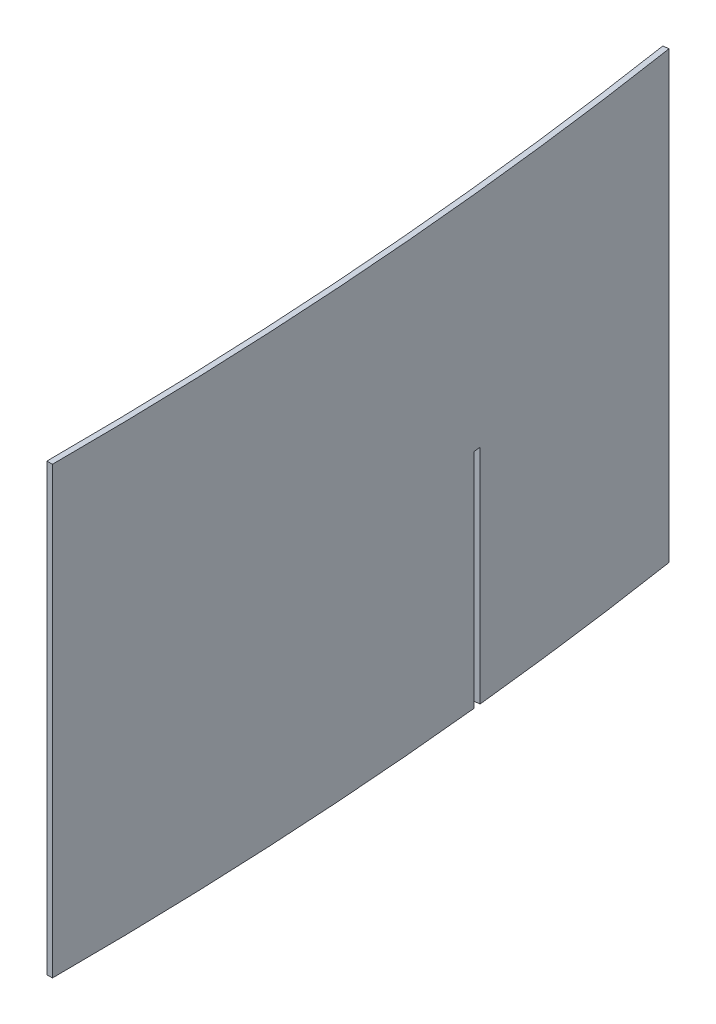
ISO-10303-21;
HEADER;
FILE_DESCRIPTION(('STEP AP214'),'2;1');
FILE_NAME('part.step','',(''),(''),'','','');
FILE_SCHEMA(('AUTOMOTIVE_DESIGN { 1 0 10303 214 1 1 1 1 }'));
ENDSEC;
DATA;
#1=APPLICATION_CONTEXT('core data for automotive mechanical design processes');
#2=APPLICATION_PROTOCOL_DEFINITION('international standard','automotive_design',2000,#1);
#3=PRODUCT_CONTEXT('',#1,'mechanical');
#4=PRODUCT('Part','Part','',(#3));
#5=PRODUCT_RELATED_PRODUCT_CATEGORY('part','',(#4));
#6=PRODUCT_DEFINITION_FORMATION('','',#4);
#7=PRODUCT_DEFINITION_CONTEXT('part definition',#1,'design');
#8=PRODUCT_DEFINITION('design','',#6,#7);
#9=PRODUCT_DEFINITION_SHAPE('','',#8);
#10=(LENGTH_UNIT() NAMED_UNIT(*) SI_UNIT(.MILLI.,.METRE.));
#11=(NAMED_UNIT(*) PLANE_ANGLE_UNIT() SI_UNIT($,.RADIAN.));
#12=(NAMED_UNIT(*) SI_UNIT($,.STERADIAN.) SOLID_ANGLE_UNIT());
#13=UNCERTAINTY_MEASURE_WITH_UNIT(LENGTH_MEASURE(1.E-05),#10,'distance_accuracy_value','');
#14=(GEOMETRIC_REPRESENTATION_CONTEXT(3) GLOBAL_UNCERTAINTY_ASSIGNED_CONTEXT((#13)) GLOBAL_UNIT_ASSIGNED_CONTEXT((#10,
#11,#12)) REPRESENTATION_CONTEXT('',''));
#15=CARTESIAN_POINT('',(0.,0.,0.));
#16=DIRECTION('',(0.,0.,1.));
#17=DIRECTION('',(1.,0.,0.));
#18=AXIS2_PLACEMENT_3D('',#15,#16,#17);
#19=CARTESIAN_POINT('',(194.448352042331,5.,-20.2506392003287));
#20=DIRECTION('',(-0.103583832226745,0.,-0.994620726559236));
#21=DIRECTION('',(0.,1.,0.));
#22=AXIS2_PLACEMENT_3D('',#19,#20,#21);
#23=PLANE('',#22);
#24=DIRECTION('',(-0.994620726559236,0.,0.103583832226745));
#25=VECTOR('',#24,1.);
#26=CARTESIAN_POINT('',(194.448352042331,0.,-20.2506392003287));
#27=LINE('',#26,#25);
#28=CARTESIAN_POINT('',(194.69700722397,0.,-20.2765351583854));
#29=VERTEX_POINT('',#28);
#30=CARTESIAN_POINT('',(194.448352042331,0.,-20.2506392003287));
#31=VERTEX_POINT('',#30);
#32=EDGE_CURVE('E11',#29,#31,#27,.T.);
#33=ORIENTED_EDGE('',*,*,#32,.F.);
#34=DIRECTION('',(0.,-1.,0.));
#35=VECTOR('',#34,1.);
#36=CARTESIAN_POINT('',(194.69700722397,46.1714986976516,-20.2765351583854));
#37=LINE('',#36,#35);
#38=CARTESIAN_POINT('',(194.69700722397,9.99999999999999,-20.2765351583854));
#39=VERTEX_POINT('',#38);
#40=EDGE_CURVE('E87',#29,#39,#37,.F.);
#41=ORIENTED_EDGE('',*,*,#40,.T.);
#42=DIRECTION('',(-0.994620726559236,0.,0.103583832226745));
#43=VECTOR('',#42,1.);
#44=CARTESIAN_POINT('',(194.448352042331,9.99999999999999,-20.2506392003287));
#45=LINE('',#44,#43);
#46=CARTESIAN_POINT('',(194.448352042331,9.99999999999999,-20.2506392003287));
#47=VERTEX_POINT('',#46);
#48=EDGE_CURVE('E49',#39,#47,#45,.T.);
#49=ORIENTED_EDGE('',*,*,#48,.T.);
#50=DIRECTION('',(0.,1.,0.));
#51=VECTOR('',#50,1.);
#52=CARTESIAN_POINT('',(194.448352042331,9.99999999999999,-20.2506392003287));
#53=LINE('',#52,#51);
#54=EDGE_CURVE('E90',#31,#47,#53,.T.);
#55=ORIENTED_EDGE('',*,*,#54,.F.);
#56=EDGE_LOOP('',(#33,#41,#49,#55));
#57=FACE_BOUND('',#56,.T.);
#58=ADVANCED_FACE('F39',(#57),#23,.F.);
#59=CARTESIAN_POINT('',(0.,9.99999999999999,0.));
#60=DIRECTION('',(0.,1.,0.));
#61=DIRECTION('',(0.,0.,1.));
#62=AXIS2_PLACEMENT_3D('',#59,#60,#61);
#63=PLANE('',#62);
#64=ORIENTED_EDGE('',*,*,#48,.F.);
#65=CARTESIAN_POINT('',(0.,9.99999999999999,0.));
#66=DIRECTION('',(0.,-1.,0.));
#67=DIRECTION('',(0.,0.,-1.));
#68=AXIS2_PLACEMENT_3D('',#65,#66,#67);
#69=CIRCLE('',#68,195.75);
#70=CARTESIAN_POINT('',(194.727873277082,9.99999999999999,-19.9779345525165));
#71=VERTEX_POINT('',#70);
#72=EDGE_CURVE('E103',#39,#71,#69,.T.);
#73=ORIENTED_EDGE('',*,*,#72,.T.);
#74=DIRECTION('',(-0.994778407545758,0.,0.102058414061387));
#75=VECTOR('',#74,1.);
#76=CARTESIAN_POINT('',(194.479178675196,9.99999999999999,-19.9524199490011));
#77=LINE('',#76,#75);
#78=CARTESIAN_POINT('',(194.479178675196,9.99999999999999,-19.9524199490011));
#79=VERTEX_POINT('',#78);
#80=EDGE_CURVE('E124',#71,#79,#77,.T.);
#81=ORIENTED_EDGE('',*,*,#80,.T.);
#82=CARTESIAN_POINT('',(0.,9.99999999999999,0.));
#83=DIRECTION('',(0.,-1.,0.));
#84=DIRECTION('',(0.,0.,1.));
#85=AXIS2_PLACEMENT_3D('',#82,#83,#84);
#86=CIRCLE('',#85,195.5);
#87=EDGE_CURVE('E107',#47,#79,#86,.T.);
#88=ORIENTED_EDGE('',*,*,#87,.F.);
#89=EDGE_LOOP('',(#64,#73,#81,#88));
#90=FACE_BOUND('',#89,.T.);
#91=ADVANCED_FACE('F138',(#90),#63,.F.);
#92=CARTESIAN_POINT('',(194.479178675196,5.,-19.9524199490011));
#93=DIRECTION('',(0.102058414061387,0.,0.994778407545758));
#94=DIRECTION('',(0.,-1.,0.));
#95=AXIS2_PLACEMENT_3D('',#92,#93,#94);
#96=PLANE('',#95);
#97=ORIENTED_EDGE('',*,*,#80,.F.);
#98=DIRECTION('',(0.,-1.,0.));
#99=VECTOR('',#98,1.);
#100=CARTESIAN_POINT('',(194.727873277082,46.1714986976516,-19.9779345525165));
#101=LINE('',#100,#99);
#102=CARTESIAN_POINT('',(194.727873277082,0.,-19.9779345525165));
#103=VERTEX_POINT('',#102);
#104=EDGE_CURVE('E163',#71,#103,#101,.T.);
#105=ORIENTED_EDGE('',*,*,#104,.T.);
#106=DIRECTION('',(-0.994778407545758,0.,0.102058414061387));
#107=VECTOR('',#106,1.);
#108=CARTESIAN_POINT('',(194.479178675196,0.,-19.9524199490011));
#109=LINE('',#108,#107);
#110=CARTESIAN_POINT('',(194.479178675196,0.,-19.9524199490011));
#111=VERTEX_POINT('',#110);
#112=EDGE_CURVE('E121',#103,#111,#109,.T.);
#113=ORIENTED_EDGE('',*,*,#112,.T.);
#114=DIRECTION('',(0.,-1.,0.));
#115=VECTOR('',#114,1.);
#116=CARTESIAN_POINT('',(194.479178675196,0.,-19.9524199490011));
#117=LINE('',#116,#115);
#118=EDGE_CURVE('E139',#79,#111,#117,.T.);
#119=ORIENTED_EDGE('',*,*,#118,.F.);
#120=EDGE_LOOP('',(#97,#105,#113,#119));
#121=FACE_BOUND('',#120,.T.);
#122=ADVANCED_FACE('F166',(#121),#96,.F.);
#123=CARTESIAN_POINT('',(0.,0.,0.));
#124=DIRECTION('',(0.,1.,0.));
#125=DIRECTION('',(0.,0.,1.));
#126=AXIS2_PLACEMENT_3D('',#123,#124,#125);
#127=PLANE('',#126);
#128=ORIENTED_EDGE('',*,*,#112,.F.);
#129=CARTESIAN_POINT('',(0.,0.,0.));
#130=DIRECTION('',(0.,-1.,0.));
#131=DIRECTION('',(0.,0.,-1.));
#132=AXIS2_PLACEMENT_3D('',#129,#130,#131);
#133=CIRCLE('',#132,195.75);
#134=CARTESIAN_POINT('',(195.75,0.,0.));
#135=VERTEX_POINT('',#134);
#136=EDGE_CURVE('E160',#103,#135,#133,.T.);
#137=ORIENTED_EDGE('',*,*,#136,.T.);
#138=DIRECTION('',(-1.,0.,0.));
#139=VECTOR('',#138,1.);
#140=CARTESIAN_POINT('',(195.5,0.,0.));
#141=LINE('',#140,#139);
#142=CARTESIAN_POINT('',(195.5,0.,0.));
#143=VERTEX_POINT('',#142);
#144=EDGE_CURVE('E118',#135,#143,#141,.T.);
#145=ORIENTED_EDGE('',*,*,#144,.T.);
#146=CARTESIAN_POINT('',(0.,0.,0.));
#147=DIRECTION('',(0.,-1.,0.));
#148=DIRECTION('',(0.,0.,-1.));
#149=AXIS2_PLACEMENT_3D('',#146,#147,#148);
#150=CIRCLE('',#149,195.5);
#151=EDGE_CURVE('E141',#111,#143,#150,.T.);
#152=ORIENTED_EDGE('',*,*,#151,.F.);
#153=EDGE_LOOP('',(#128,#137,#145,#152));
#154=FACE_BOUND('',#153,.T.);
#155=ADVANCED_FACE('F172',(#154),#127,.F.);
#156=CARTESIAN_POINT('',(195.5,10.,0.));
#157=DIRECTION('',(0.,0.,-1.));
#158=DIRECTION('',(0.,1.,0.));
#159=AXIS2_PLACEMENT_3D('',#156,#157,#158);
#160=PLANE('',#159);
#161=ORIENTED_EDGE('',*,*,#144,.F.);
#162=DIRECTION('',(0.,-1.,0.));
#163=VECTOR('',#162,1.);
#164=CARTESIAN_POINT('',(195.75,46.1714986976516,0.));
#165=LINE('',#164,#163);
#166=CARTESIAN_POINT('',(195.75,20.,0.));
#167=VERTEX_POINT('',#166);
#168=EDGE_CURVE('E157',#135,#167,#165,.F.);
#169=ORIENTED_EDGE('',*,*,#168,.T.);
#170=DIRECTION('',(-1.,0.,0.));
#171=VECTOR('',#170,1.);
#172=CARTESIAN_POINT('',(195.5,20.,0.));
#173=LINE('',#172,#171);
#174=CARTESIAN_POINT('',(195.5,20.,0.));
#175=VERTEX_POINT('',#174);
#176=EDGE_CURVE('E115',#167,#175,#173,.T.);
#177=ORIENTED_EDGE('',*,*,#176,.T.);
#178=DIRECTION('',(0.,1.,0.));
#179=VECTOR('',#178,1.);
#180=CARTESIAN_POINT('',(195.5,0.,0.));
#181=LINE('',#180,#179);
#182=EDGE_CURVE('E146',#143,#175,#181,.T.);
#183=ORIENTED_EDGE('',*,*,#182,.F.);
#184=EDGE_LOOP('',(#161,#169,#177,#183));
#185=FACE_BOUND('',#184,.T.);
#186=ADVANCED_FACE('F180',(#185),#160,.F.);
#187=CARTESIAN_POINT('',(0.,20.,0.));
#188=DIRECTION('',(0.,-1.,0.));
#189=DIRECTION('',(0.,0.,-1.));
#190=AXIS2_PLACEMENT_3D('',#187,#188,#189);
#191=PLANE('',#190);
#192=ORIENTED_EDGE('',*,*,#176,.F.);
#193=CARTESIAN_POINT('',(0.,20.,0.));
#194=DIRECTION('',(0.,-1.,0.));
#195=DIRECTION('',(0.,0.,-1.));
#196=AXIS2_PLACEMENT_3D('',#193,#194,#195);
#197=CIRCLE('',#196,195.75);
#198=CARTESIAN_POINT('',(193.43153630674,20.,-30.0383631713555));
#199=VERTEX_POINT('',#198);
#200=EDGE_CURVE('E109',#167,#199,#197,.F.);
#201=ORIENTED_EDGE('',*,*,#200,.T.);
#202=DIRECTION('',(-0.988155996458443,0.,0.153452685421995));
#203=VECTOR('',#202,1.);
#204=CARTESIAN_POINT('',(193.184497307626,20.,-30.));
#205=LINE('',#204,#203);
#206=CARTESIAN_POINT('',(193.184497307626,20.,-30.));
#207=VERTEX_POINT('',#206);
#208=EDGE_CURVE('E113',#199,#207,#205,.T.);
#209=ORIENTED_EDGE('',*,*,#208,.T.);
#210=CARTESIAN_POINT('',(0.,20.,0.));
#211=DIRECTION('',(0.,1.,0.));
#212=DIRECTION('',(0.,0.,1.));
#213=AXIS2_PLACEMENT_3D('',#210,#211,#212);
#214=CIRCLE('',#213,195.5);
#215=EDGE_CURVE('E149',#175,#207,#214,.T.);
#216=ORIENTED_EDGE('',*,*,#215,.F.);
#217=EDGE_LOOP('',(#192,#201,#209,#216));
#218=FACE_BOUND('',#217,.T.);
#219=ADVANCED_FACE('F182',(#218),#191,.F.);
#220=CARTESIAN_POINT('',(193.184497307626,10.,-30.));
#221=DIRECTION('',(0.153452685421995,0.,0.988155996458443));
#222=DIRECTION('',(0.,-1.,0.));
#223=AXIS2_PLACEMENT_3D('',#220,#221,#222);
#224=PLANE('',#223);
#225=ORIENTED_EDGE('',*,*,#208,.F.);
#226=DIRECTION('',(0.,-1.,0.));
#227=VECTOR('',#226,1.);
#228=CARTESIAN_POINT('',(193.43153630674,46.1714986976516,-30.0383631713555));
#229=LINE('',#228,#227);
#230=CARTESIAN_POINT('',(193.43153630674,0.,-30.0383631713555));
#231=VERTEX_POINT('',#230);
#232=EDGE_CURVE('E105',#199,#231,#229,.T.);
#233=ORIENTED_EDGE('',*,*,#232,.T.);
#234=DIRECTION('',(-0.988155996458443,0.,0.153452685421995));
#235=VECTOR('',#234,1.);
#236=CARTESIAN_POINT('',(193.184497307626,0.,-30.));
#237=LINE('',#236,#235);
#238=CARTESIAN_POINT('',(193.184497307626,0.,-30.));
#239=VERTEX_POINT('',#238);
#240=EDGE_CURVE('E43',#231,#239,#237,.T.);
#241=ORIENTED_EDGE('',*,*,#240,.T.);
#242=DIRECTION('',(0.,-1.,0.));
#243=VECTOR('',#242,1.);
#244=CARTESIAN_POINT('',(193.184497307626,20.,-30.));
#245=LINE('',#244,#243);
#246=EDGE_CURVE('E152',#207,#239,#245,.T.);
#247=ORIENTED_EDGE('',*,*,#246,.F.);
#248=EDGE_LOOP('',(#225,#233,#241,#247));
#249=FACE_BOUND('',#248,.T.);
#250=ADVANCED_FACE('F183',(#249),#224,.F.);
#251=CARTESIAN_POINT('',(0.,0.,0.));
#252=DIRECTION('',(0.,1.,0.));
#253=DIRECTION('',(0.,0.,1.));
#254=AXIS2_PLACEMENT_3D('',#251,#252,#253);
#255=PLANE('',#254);
#256=CARTESIAN_POINT('',(0.,0.,0.));
#257=DIRECTION('',(0.,-1.,0.));
#258=DIRECTION('',(0.,0.,-1.));
#259=AXIS2_PLACEMENT_3D('',#256,#257,#258);
#260=CIRCLE('',#259,195.75);
#261=EDGE_CURVE('E100',#231,#29,#260,.T.);
#262=ORIENTED_EDGE('',*,*,#261,.T.);
#263=ORIENTED_EDGE('',*,*,#32,.T.);
#264=CARTESIAN_POINT('',(0.,0.,0.));
#265=DIRECTION('',(0.,-1.,0.));
#266=DIRECTION('',(0.,0.,-1.));
#267=AXIS2_PLACEMENT_3D('',#264,#265,#266);
#268=CIRCLE('',#267,195.5);
#269=EDGE_CURVE('E137',#239,#31,#268,.T.);
#270=ORIENTED_EDGE('',*,*,#269,.F.);
#271=ORIENTED_EDGE('',*,*,#240,.F.);
#272=EDGE_LOOP('',(#262,#263,#270,#271));
#273=FACE_BOUND('',#272,.T.);
#274=ADVANCED_FACE('F41',(#273),#255,.F.);
#275=CARTESIAN_POINT('',(0.,46.1714986976516,0.));
#276=DIRECTION('',(0.,-1.,0.));
#277=DIRECTION('',(0.,0.,-1.));
#278=AXIS2_PLACEMENT_3D('',#275,#276,#277);
#279=CYLINDRICAL_SURFACE('',#278,195.5);
#280=ORIENTED_EDGE('',*,*,#246,.T.);
#281=ORIENTED_EDGE('',*,*,#269,.T.);
#282=ORIENTED_EDGE('',*,*,#54,.T.);
#283=ORIENTED_EDGE('',*,*,#87,.T.);
#284=ORIENTED_EDGE('',*,*,#118,.T.);
#285=ORIENTED_EDGE('',*,*,#151,.T.);
#286=ORIENTED_EDGE('',*,*,#182,.T.);
#287=ORIENTED_EDGE('',*,*,#215,.T.);
#288=EDGE_LOOP('',(#280,#281,#282,#283,#284,#285,#286,#287));
#289=FACE_BOUND('',#288,.T.);
#290=ADVANCED_FACE('F134',(#289),#279,.F.);
#291=CARTESIAN_POINT('',(0.,46.1714986976516,0.));
#292=DIRECTION('',(0.,-1.,0.));
#293=DIRECTION('',(0.,0.,-1.));
#294=AXIS2_PLACEMENT_3D('',#291,#292,#293);
#295=CYLINDRICAL_SURFACE('',#294,195.75);
#296=ORIENTED_EDGE('',*,*,#232,.F.);
#297=ORIENTED_EDGE('',*,*,#200,.F.);
#298=ORIENTED_EDGE('',*,*,#168,.F.);
#299=ORIENTED_EDGE('',*,*,#136,.F.);
#300=ORIENTED_EDGE('',*,*,#104,.F.);
#301=ORIENTED_EDGE('',*,*,#72,.F.);
#302=ORIENTED_EDGE('',*,*,#40,.F.);
#303=ORIENTED_EDGE('',*,*,#261,.F.);
#304=EDGE_LOOP('',(#296,#297,#298,#299,#300,#301,#302,#303));
#305=FACE_BOUND('',#304,.T.);
#306=ADVANCED_FACE('F99',(#305),#295,.T.);
#307=CLOSED_SHELL('',(#58,#91,#122,#155,#186,#219,#250,#274,#290,#306));
#308=MANIFOLD_SOLID_BREP('B2',#307);
#309=ADVANCED_BREP_SHAPE_REPRESENTATION('',(#18,#308),#14);
#310=SHAPE_DEFINITION_REPRESENTATION(#9,#309);
ENDSEC;
END-ISO-10303-21;
